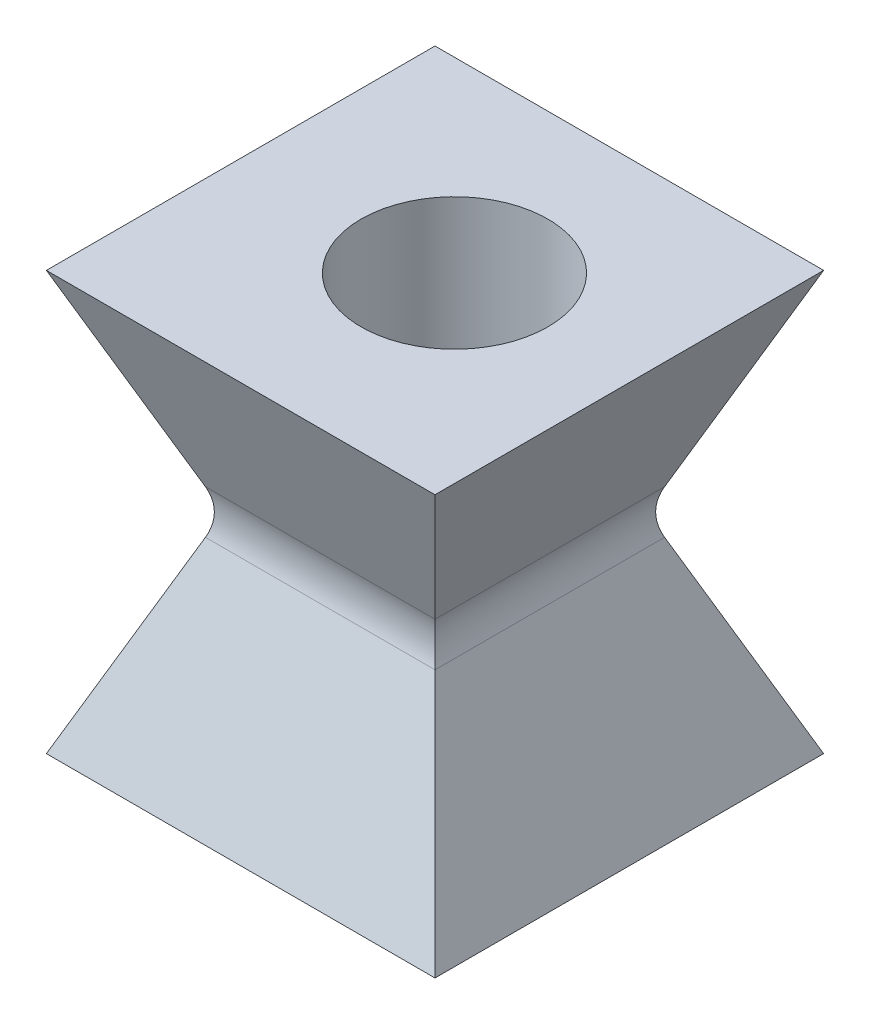
ISO-10303-21;
HEADER;
FILE_DESCRIPTION(('STEP AP214'),'2;1');
FILE_NAME('part.step','',(''),(''),'','','');
FILE_SCHEMA(('AUTOMOTIVE_DESIGN { 1 0 10303 214 1 1 1 1 }'));
ENDSEC;
DATA;
#1=APPLICATION_CONTEXT('core data for automotive mechanical design processes');
#2=APPLICATION_PROTOCOL_DEFINITION('international standard','automotive_design',2000,#1);
#3=PRODUCT_CONTEXT('',#1,'mechanical');
#4=PRODUCT('Part','Part','',(#3));
#5=PRODUCT_RELATED_PRODUCT_CATEGORY('part','',(#4));
#6=PRODUCT_DEFINITION_FORMATION('','',#4);
#7=PRODUCT_DEFINITION_CONTEXT('part definition',#1,'design');
#8=PRODUCT_DEFINITION('design','',#6,#7);
#9=PRODUCT_DEFINITION_SHAPE('','',#8);
#10=(LENGTH_UNIT() NAMED_UNIT(*) SI_UNIT(.MILLI.,.METRE.));
#11=(NAMED_UNIT(*) PLANE_ANGLE_UNIT() SI_UNIT($,.RADIAN.));
#12=(NAMED_UNIT(*) SI_UNIT($,.STERADIAN.) SOLID_ANGLE_UNIT());
#13=UNCERTAINTY_MEASURE_WITH_UNIT(LENGTH_MEASURE(1.E-05),#10,'distance_accuracy_value','');
#14=(GEOMETRIC_REPRESENTATION_CONTEXT(3) GLOBAL_UNCERTAINTY_ASSIGNED_CONTEXT((#13)) GLOBAL_UNIT_ASSIGNED_CONTEXT((#10,
#11,#12)) REPRESENTATION_CONTEXT('',''));
#15=CARTESIAN_POINT('',(0.,0.,0.));
#16=DIRECTION('',(0.,0.,1.));
#17=DIRECTION('',(1.,0.,0.));
#18=AXIS2_PLACEMENT_3D('',#15,#16,#17);
#19=CARTESIAN_POINT('',(0.,0.,104.));
#20=DIRECTION('',(0.920504853452438,0.390731128489278,0.));
#21=DIRECTION('',(-0.390731128489278,0.920504853452439,0.));
#22=AXIS2_PLACEMENT_3D('',#19,#20,#21);
#23=PLANE('',#22);
#24=DIRECTION('',(-0.363936289648106,0.857380168976599,-0.363936289648103));
#25=VECTOR('',#24,1.);
#26=CARTESIAN_POINT('',(10.6263551405311,-25.0341238979032,34.3969448482689));
#27=LINE('',#26,#25);
#28=CARTESIAN_POINT('',(-2.48783285929287,5.86096692733911,21.2827568484451));
#29=VERTEX_POINT('',#28);
#30=CARTESIAN_POINT('',(-23.7705897077382,56.,0.));
#31=VERTEX_POINT('',#30);
#32=EDGE_CURVE('E182',#29,#31,#27,.T.);
#33=ORIENTED_EDGE('',*,*,#32,.F.);
#34=DIRECTION('',(0.,0.,-1.));
#35=VECTOR('',#34,1.);
#36=CARTESIAN_POINT('',(-2.4878328592929,5.86096692733917,104.));
#37=LINE('',#36,#35);
#38=CARTESIAN_POINT('',(-2.48783285929288,5.86096692733912,82.7172431515549));
#39=VERTEX_POINT('',#38);
#40=EDGE_CURVE('E146',#29,#39,#37,.F.);
#41=ORIENTED_EDGE('',*,*,#40,.T.);
#42=DIRECTION('',(-0.363936289648106,0.857380168976599,0.363936289648103));
#43=VECTOR('',#42,1.);
#44=CARTESIAN_POINT('',(-3.14840564344317,7.41717888367835,83.3778159357052));
#45=LINE('',#44,#43);
#46=CARTESIAN_POINT('',(-23.7705897077382,56.,104.));
#47=VERTEX_POINT('',#46);
#48=EDGE_CURVE('E186',#39,#47,#45,.T.);
#49=ORIENTED_EDGE('',*,*,#48,.T.);
#50=DIRECTION('',(0.,0.,-1.));
#51=VECTOR('',#50,1.);
#52=CARTESIAN_POINT('',(-23.7705897077382,56.,104.));
#53=LINE('',#52,#51);
#54=EDGE_CURVE('E136',#47,#31,#53,.T.);
#55=ORIENTED_EDGE('',*,*,#54,.T.);
#56=EDGE_LOOP('',(#33,#41,#49,#55));
#57=FACE_BOUND('',#56,.T.);
#58=ADVANCED_FACE('F43',(#57),#23,.F.);
#59=CARTESIAN_POINT('',(0.,0.,104.));
#60=DIRECTION('',(-0.920504853452438,0.390731128489278,0.));
#61=DIRECTION('',(-0.390731128489278,-0.920504853452439,0.));
#62=AXIS2_PLACEMENT_3D('',#59,#60,#61);
#63=PLANE('',#62);
#64=DIRECTION('',(0.363936289648106,0.857380168976599,-0.363936289648103));
#65=VECTOR('',#64,1.);
#66=CARTESIAN_POINT('',(-3.14840564344317,-7.41717888367835,83.3778159357052));
#67=LINE('',#66,#65);
#68=CARTESIAN_POINT('',(-23.7705897077382,-56.,104.));
#69=VERTEX_POINT('',#68);
#70=CARTESIAN_POINT('',(-2.48783285929288,-5.86096692733912,82.7172431515549));
#71=VERTEX_POINT('',#70);
#72=EDGE_CURVE('E190',#69,#71,#67,.T.);
#73=ORIENTED_EDGE('',*,*,#72,.T.);
#74=DIRECTION('',(0.,0.,-1.));
#75=VECTOR('',#74,1.);
#76=CARTESIAN_POINT('',(-2.4878328592929,-5.86096692733917,104.));
#77=LINE('',#76,#75);
#78=CARTESIAN_POINT('',(-2.48783285929287,-5.86096692733911,21.2827568484451));
#79=VERTEX_POINT('',#78);
#80=EDGE_CURVE('E130',#71,#79,#77,.T.);
#81=ORIENTED_EDGE('',*,*,#80,.T.);
#82=DIRECTION('',(0.363936289648106,0.857380168976599,0.363936289648103));
#83=VECTOR('',#82,1.);
#84=CARTESIAN_POINT('',(10.6263551405311,25.0341238979032,34.3969448482689));
#85=LINE('',#84,#83);
#86=CARTESIAN_POINT('',(-23.7705897077382,-56.,0.));
#87=VERTEX_POINT('',#86);
#88=EDGE_CURVE('E113',#87,#79,#85,.T.);
#89=ORIENTED_EDGE('',*,*,#88,.F.);
#90=DIRECTION('',(0.,0.,-1.));
#91=VECTOR('',#90,1.);
#92=CARTESIAN_POINT('',(-23.7705897077382,-56.,104.));
#93=LINE('',#92,#91);
#94=EDGE_CURVE('E127',#69,#87,#93,.T.);
#95=ORIENTED_EDGE('',*,*,#94,.F.);
#96=EDGE_LOOP('',(#73,#81,#89,#95));
#97=FACE_BOUND('',#96,.T.);
#98=ADVANCED_FACE('F126',(#97),#63,.T.);
#99=CARTESIAN_POINT('',(47.8392064449027,20.3065383633137,104.));
#100=DIRECTION('',(0.920504853452439,0.390731128489277,0.));
#101=DIRECTION('',(-0.390731128489278,0.920504853452439,0.));
#102=AXIS2_PLACEMENT_3D('',#99,#100,#101);
#103=PLANE('',#102);
#104=DIRECTION('',(0.363936289648106,-0.857380168976599,-0.363936289648103));
#105=VECTOR('',#104,1.);
#106=CARTESIAN_POINT('',(38.3545159469048,42.651068912128,41.8748943453567));
#107=LINE('',#106,#105);
#108=CARTESIAN_POINT('',(58.9466534438166,-5.86096692733915,21.2827568484451));
#109=VERTEX_POINT('',#108);
#110=CARTESIAN_POINT('',(80.2294102922618,-56.,0.));
#111=VERTEX_POINT('',#110);
#112=EDGE_CURVE('E114',#109,#111,#107,.T.);
#113=ORIENTED_EDGE('',*,*,#112,.F.);
#114=DIRECTION('',(0.,0.,-1.));
#115=VECTOR('',#114,1.);
#116=CARTESIAN_POINT('',(58.9466534438166,-5.86096692733917,104.));
#117=LINE('',#116,#115);
#118=CARTESIAN_POINT('',(58.9466534438166,-5.86096692733912,82.7172431515549));
#119=VERTEX_POINT('',#118);
#120=EDGE_CURVE('E60',#109,#119,#117,.F.);
#121=ORIENTED_EDGE('',*,*,#120,.T.);
#122=DIRECTION('',(0.363936289648106,-0.8573801689766,0.363936289648103));
#123=VECTOR('',#122,1.);
#124=CARTESIAN_POINT('',(52.129276730879,10.1997661305465,75.8998664386174));
#125=LINE('',#124,#123);
#126=CARTESIAN_POINT('',(80.2294102922618,-56.,104.));
#127=VERTEX_POINT('',#126);
#128=EDGE_CURVE('E188',#119,#127,#125,.T.);
#129=ORIENTED_EDGE('',*,*,#128,.T.);
#130=DIRECTION('',(0.,0.,-1.));
#131=VECTOR('',#130,1.);
#132=CARTESIAN_POINT('',(80.2294102922618,-56.,104.));
#133=LINE('',#132,#131);
#134=EDGE_CURVE('E137',#127,#111,#133,.T.);
#135=ORIENTED_EDGE('',*,*,#134,.T.);
#136=EDGE_LOOP('',(#113,#121,#129,#135));
#137=FACE_BOUND('',#136,.T.);
#138=ADVANCED_FACE('F235',(#137),#103,.T.);
#139=CARTESIAN_POINT('',(47.8392064449027,-20.3065383633137,104.));
#140=DIRECTION('',(-0.920504853452439,0.390731128489277,0.));
#141=DIRECTION('',(-0.390731128489278,-0.920504853452439,0.));
#142=AXIS2_PLACEMENT_3D('',#139,#140,#141);
#143=PLANE('',#142);
#144=DIRECTION('',(-0.363936289648106,-0.8573801689766,-0.363936289648103));
#145=VECTOR('',#144,1.);
#146=CARTESIAN_POINT('',(52.129276730879,-10.1997661305465,75.8998664386174));
#147=LINE('',#146,#145);
#148=CARTESIAN_POINT('',(80.2294102922618,56.,104.));
#149=VERTEX_POINT('',#148);
#150=CARTESIAN_POINT('',(58.9466534438166,5.86096692733912,82.7172431515549));
#151=VERTEX_POINT('',#150);
#152=EDGE_CURVE('E184',#149,#151,#147,.T.);
#153=ORIENTED_EDGE('',*,*,#152,.T.);
#154=DIRECTION('',(0.,0.,-1.));
#155=VECTOR('',#154,1.);
#156=CARTESIAN_POINT('',(58.9466534438166,5.86096692733917,104.));
#157=LINE('',#156,#155);
#158=CARTESIAN_POINT('',(58.9466534438166,5.86096692733915,21.2827568484451));
#159=VERTEX_POINT('',#158);
#160=EDGE_CURVE('E153',#151,#159,#157,.T.);
#161=ORIENTED_EDGE('',*,*,#160,.T.);
#162=DIRECTION('',(-0.363936289648106,-0.857380168976599,0.363936289648103));
#163=VECTOR('',#162,1.);
#164=CARTESIAN_POINT('',(38.3545159469048,-42.651068912128,41.8748943453567));
#165=LINE('',#164,#163);
#166=CARTESIAN_POINT('',(80.2294102922618,56.,0.));
#167=VERTEX_POINT('',#166);
#168=EDGE_CURVE('E131',#167,#159,#165,.T.);
#169=ORIENTED_EDGE('',*,*,#168,.F.);
#170=DIRECTION('',(0.,0.,-1.));
#171=VECTOR('',#170,1.);
#172=CARTESIAN_POINT('',(80.2294102922618,56.,104.));
#173=LINE('',#172,#171);
#174=EDGE_CURVE('E141',#149,#167,#173,.T.);
#175=ORIENTED_EDGE('',*,*,#174,.F.);
#176=EDGE_LOOP('',(#153,#161,#169,#175));
#177=FACE_BOUND('',#176,.T.);
#178=ADVANCED_FACE('F204',(#177),#143,.F.);
#179=CARTESIAN_POINT('',(0.,56.,104.));
#180=DIRECTION('',(0.,-1.,0.));
#181=DIRECTION('',(1.,0.,0.));
#182=AXIS2_PLACEMENT_3D('',#179,#180,#181);
#183=PLANE('',#182);
#184=CARTESIAN_POINT('',(31.4375180524234,56.,50.));
#185=DIRECTION('',(0.,1.,0.));
#186=DIRECTION('',(-1.,0.,0.));
#187=AXIS2_PLACEMENT_3D('',#184,#185,#186);
#188=CIRCLE('',#187,25.);
#189=CARTESIAN_POINT('',(6.43751805242344,56.,50.));
#190=VERTEX_POINT('',#189);
#191=EDGE_CURVE('E167',#190,#190,#188,.T.);
#192=ORIENTED_EDGE('',*,*,#191,.F.);
#193=EDGE_LOOP('',(#192));
#194=FACE_BOUND('',#193,.T.);
#195=DIRECTION('',(-1.,0.,0.));
#196=VECTOR('',#195,1.);
#197=CARTESIAN_POINT('',(0.,56.,0.));
#198=LINE('',#197,#196);
#199=EDGE_CURVE('E120',#167,#31,#198,.T.);
#200=ORIENTED_EDGE('',*,*,#199,.T.);
#201=ORIENTED_EDGE('',*,*,#54,.F.);
#202=DIRECTION('',(-1.,0.,0.));
#203=VECTOR('',#202,1.);
#204=CARTESIAN_POINT('',(0.,56.,104.));
#205=LINE('',#204,#203);
#206=EDGE_CURVE('E119',#149,#47,#205,.T.);
#207=ORIENTED_EDGE('',*,*,#206,.F.);
#208=ORIENTED_EDGE('',*,*,#174,.T.);
#209=EDGE_LOOP('',(#200,#201,#207,#208));
#210=FACE_BOUND('',#209,.T.);
#211=ADVANCED_FACE('F200',(#194,#210),#183,.F.);
#212=CARTESIAN_POINT('',(0.,-56.,104.));
#213=DIRECTION('',(0.,-1.,0.));
#214=DIRECTION('',(1.,0.,0.));
#215=AXIS2_PLACEMENT_3D('',#212,#213,#214);
#216=PLANE('',#215);
#217=CARTESIAN_POINT('',(31.4375180524235,-56.,50.));
#218=DIRECTION('',(0.,1.,0.));
#219=DIRECTION('',(-1.,0.,0.));
#220=AXIS2_PLACEMENT_3D('',#217,#218,#219);
#221=CIRCLE('',#220,25.);
#222=CARTESIAN_POINT('',(6.43751805242345,-56.,50.));
#223=VERTEX_POINT('',#222);
#224=EDGE_CURVE('E172',#223,#223,#221,.T.);
#225=ORIENTED_EDGE('',*,*,#224,.T.);
#226=EDGE_LOOP('',(#225));
#227=FACE_BOUND('',#226,.T.);
#228=DIRECTION('',(-1.,0.,0.));
#229=VECTOR('',#228,1.);
#230=CARTESIAN_POINT('',(0.,-56.,0.));
#231=LINE('',#230,#229);
#232=EDGE_CURVE('E110',#111,#87,#231,.T.);
#233=ORIENTED_EDGE('',*,*,#232,.F.);
#234=ORIENTED_EDGE('',*,*,#134,.F.);
#235=DIRECTION('',(-1.,0.,0.));
#236=VECTOR('',#235,1.);
#237=CARTESIAN_POINT('',(0.,-56.,104.));
#238=LINE('',#237,#236);
#239=EDGE_CURVE('E135',#127,#69,#238,.T.);
#240=ORIENTED_EDGE('',*,*,#239,.T.);
#241=ORIENTED_EDGE('',*,*,#94,.T.);
#242=EDGE_LOOP('',(#233,#234,#240,#241));
#243=FACE_BOUND('',#242,.T.);
#244=ADVANCED_FACE('F133',(#227,#243),#216,.T.);
#245=CARTESIAN_POINT('',(80.2294102922618,8.54956562714811,20.1415144094823));
#246=DIRECTION('',(0.,-0.390731128489275,-0.92050485345244));
#247=DIRECTION('',(0.,0.92050485345244,-0.390731128489275));
#248=AXIS2_PLACEMENT_3D('',#245,#246,#247);
#249=PLANE('',#248);
#250=ORIENTED_EDGE('',*,*,#168,.T.);
#251=DIRECTION('',(-1.,0.,0.));
#252=VECTOR('',#251,1.);
#253=CARTESIAN_POINT('',(80.2294102922618,5.86096692733912,21.2827568484451));
#254=LINE('',#253,#252);
#255=EDGE_CURVE('E149',#159,#29,#254,.T.);
#256=ORIENTED_EDGE('',*,*,#255,.T.);
#257=ORIENTED_EDGE('',*,*,#32,.T.);
#258=ORIENTED_EDGE('',*,*,#199,.F.);
#259=EDGE_LOOP('',(#250,#256,#257,#258));
#260=FACE_BOUND('',#259,.T.);
#261=ADVANCED_FACE('F207',(#260),#249,.T.);
#262=CARTESIAN_POINT('',(80.2294102922618,-8.54956562714811,20.1415144094823));
#263=DIRECTION('',(0.,-0.390731128489275,0.92050485345244));
#264=DIRECTION('',(0.,-0.92050485345244,-0.390731128489275));
#265=AXIS2_PLACEMENT_3D('',#262,#263,#264);
#266=PLANE('',#265);
#267=ORIENTED_EDGE('',*,*,#88,.T.);
#268=DIRECTION('',(-1.,0.,0.));
#269=VECTOR('',#268,1.);
#270=CARTESIAN_POINT('',(80.2294102922618,-5.86096692733912,21.2827568484451));
#271=LINE('',#270,#269);
#272=EDGE_CURVE('E151',#79,#109,#271,.F.);
#273=ORIENTED_EDGE('',*,*,#272,.T.);
#274=ORIENTED_EDGE('',*,*,#112,.T.);
#275=ORIENTED_EDGE('',*,*,#232,.T.);
#276=EDGE_LOOP('',(#267,#273,#274,#275));
#277=FACE_BOUND('',#276,.T.);
#278=ADVANCED_FACE('F112',(#277),#266,.F.);
#279=CARTESIAN_POINT('',(80.2294102922618,-28.8561039904618,67.9807208543855));
#280=DIRECTION('',(0.,0.390731128489275,-0.92050485345244));
#281=DIRECTION('',(0.,0.92050485345244,0.390731128489275));
#282=AXIS2_PLACEMENT_3D('',#279,#280,#281);
#283=PLANE('',#282);
#284=ORIENTED_EDGE('',*,*,#48,.F.);
#285=DIRECTION('',(-1.,0.,0.));
#286=VECTOR('',#285,1.);
#287=CARTESIAN_POINT('',(80.2294102922618,5.86096692733912,82.7172431515549));
#288=LINE('',#287,#286);
#289=EDGE_CURVE('E11',#39,#151,#288,.F.);
#290=ORIENTED_EDGE('',*,*,#289,.T.);
#291=ORIENTED_EDGE('',*,*,#152,.F.);
#292=ORIENTED_EDGE('',*,*,#206,.T.);
#293=EDGE_LOOP('',(#284,#290,#291,#292));
#294=FACE_BOUND('',#293,.T.);
#295=ADVANCED_FACE('F217',(#294),#283,.F.);
#296=CARTESIAN_POINT('',(80.2294102922618,28.8561039904618,67.9807208543855));
#297=DIRECTION('',(0.,0.390731128489275,0.92050485345244));
#298=DIRECTION('',(0.,-0.92050485345244,0.390731128489275));
#299=AXIS2_PLACEMENT_3D('',#296,#297,#298);
#300=PLANE('',#299);
#301=ORIENTED_EDGE('',*,*,#128,.F.);
#302=DIRECTION('',(-1.,0.,0.));
#303=VECTOR('',#302,1.);
#304=CARTESIAN_POINT('',(80.2294102922618,-5.86096692733912,82.7172431515549));
#305=LINE('',#304,#303);
#306=EDGE_CURVE('E52',#119,#71,#305,.T.);
#307=ORIENTED_EDGE('',*,*,#306,.T.);
#308=ORIENTED_EDGE('',*,*,#72,.F.);
#309=ORIENTED_EDGE('',*,*,#239,.F.);
#310=EDGE_LOOP('',(#301,#307,#308,#309));
#311=FACE_BOUND('',#310,.T.);
#312=ADVANCED_FACE('F219',(#311),#300,.T.);
#313=CARTESIAN_POINT('',(31.4375180524235,-56.,50.));
#314=DIRECTION('',(0.,1.,0.));
#315=DIRECTION('',(-1.,0.,0.));
#316=AXIS2_PLACEMENT_3D('',#313,#314,#315);
#317=CYLINDRICAL_SURFACE('',#316,25.);
#318=ORIENTED_EDGE('',*,*,#224,.F.);
#319=EDGE_LOOP('',(#318));
#320=FACE_BOUND('',#319,.T.);
#321=ORIENTED_EDGE('',*,*,#191,.T.);
#322=EDGE_LOOP('',(#321));
#323=FACE_BOUND('',#322,.T.);
#324=ADVANCED_FACE('F225',(#320,#323),#317,.F.);
#325=CARTESIAN_POINT('',(72.7542262456031,0.,104.));
#326=DIRECTION('',(0.,0.,-1.));
#327=DIRECTION('',(-1.,0.,0.));
#328=AXIS2_PLACEMENT_3D('',#325,#326,#327);
#329=CYLINDRICAL_SURFACE('',#328,15.);
#330=CARTESIAN_POINT('',(72.7542262456031,0.,7.47518404665848));
#331=DIRECTION('',(-0.707106781186548,0.,-0.707106781186547));
#332=DIRECTION('',(0.707106781186548,0.,-0.707106781186547));
#333=AXIS2_PLACEMENT_3D('',#330,#331,#332);
#334=ELLIPSE('',#333,21.2132034355964,15.);
#335=EDGE_CURVE('E160',#159,#109,#334,.F.);
#336=ORIENTED_EDGE('',*,*,#335,.F.);
#337=ORIENTED_EDGE('',*,*,#160,.F.);
#338=CARTESIAN_POINT('',(72.7542262456031,0.,96.5248159533415));
#339=DIRECTION('',(-0.707106781186548,0.,0.707106781186547));
#340=DIRECTION('',(-0.707106781186548,0.,-0.707106781186547));
#341=AXIS2_PLACEMENT_3D('',#338,#339,#340);
#342=ELLIPSE('',#341,21.2132034355964,15.);
#343=EDGE_CURVE('E47',#119,#151,#342,.F.);
#344=ORIENTED_EDGE('',*,*,#343,.F.);
#345=ORIENTED_EDGE('',*,*,#120,.F.);
#346=EDGE_LOOP('',(#336,#337,#344,#345));
#347=FACE_BOUND('',#346,.T.);
#348=ADVANCED_FACE('F45',(#347),#329,.F.);
#349=CARTESIAN_POINT('',(80.2294102922618,0.,96.5248159533415));
#350=DIRECTION('',(-1.,0.,0.));
#351=DIRECTION('',(0.,0.,1.));
#352=AXIS2_PLACEMENT_3D('',#349,#350,#351);
#353=CYLINDRICAL_SURFACE('',#352,15.);
#354=ORIENTED_EDGE('',*,*,#343,.T.);
#355=ORIENTED_EDGE('',*,*,#289,.F.);
#356=CARTESIAN_POINT('',(-16.2954056610795,0.,96.5248159533415));
#357=DIRECTION('',(-0.707106781186547,0.,-0.707106781186547));
#358=DIRECTION('',(-0.707106781186547,0.,0.707106781186547));
#359=AXIS2_PLACEMENT_3D('',#356,#357,#358);
#360=ELLIPSE('',#359,21.2132034355964,15.);
#361=EDGE_CURVE('E159',#71,#39,#360,.F.);
#362=ORIENTED_EDGE('',*,*,#361,.F.);
#363=ORIENTED_EDGE('',*,*,#306,.F.);
#364=EDGE_LOOP('',(#354,#355,#362,#363));
#365=FACE_BOUND('',#364,.T.);
#366=ADVANCED_FACE('F245',(#365),#353,.F.);
#367=CARTESIAN_POINT('',(80.2294102922618,0.,7.47518404665848));
#368=DIRECTION('',(-1.,0.,0.));
#369=DIRECTION('',(0.,0.,1.));
#370=AXIS2_PLACEMENT_3D('',#367,#368,#369);
#371=CYLINDRICAL_SURFACE('',#370,15.);
#372=ORIENTED_EDGE('',*,*,#335,.T.);
#373=ORIENTED_EDGE('',*,*,#272,.F.);
#374=CARTESIAN_POINT('',(-16.2954056610795,0.,7.47518404665848));
#375=DIRECTION('',(-0.707106781186547,0.,0.707106781186547));
#376=DIRECTION('',(-0.707106781186547,0.,-0.707106781186547));
#377=AXIS2_PLACEMENT_3D('',#374,#375,#376);
#378=ELLIPSE('',#377,21.2132034355964,15.);
#379=EDGE_CURVE('E157',#29,#79,#378,.F.);
#380=ORIENTED_EDGE('',*,*,#379,.F.);
#381=ORIENTED_EDGE('',*,*,#255,.F.);
#382=EDGE_LOOP('',(#372,#373,#380,#381));
#383=FACE_BOUND('',#382,.T.);
#384=ADVANCED_FACE('F211',(#383),#371,.F.);
#385=CARTESIAN_POINT('',(-16.2954056610795,0.,104.));
#386=DIRECTION('',(0.,0.,-1.));
#387=DIRECTION('',(-1.,0.,0.));
#388=AXIS2_PLACEMENT_3D('',#385,#386,#387);
#389=CYLINDRICAL_SURFACE('',#388,15.);
#390=ORIENTED_EDGE('',*,*,#361,.T.);
#391=ORIENTED_EDGE('',*,*,#40,.F.);
#392=ORIENTED_EDGE('',*,*,#379,.T.);
#393=ORIENTED_EDGE('',*,*,#80,.F.);
#394=EDGE_LOOP('',(#390,#391,#392,#393));
#395=FACE_BOUND('',#394,.T.);
#396=ADVANCED_FACE('F214',(#395),#389,.F.);
#397=CLOSED_SHELL('',(#58,#98,#138,#178,#211,#244,#261,#278,#295,#312,#324,#348,#366,#384,#396));
#398=MANIFOLD_SOLID_BREP('B2',#397);
#399=ADVANCED_BREP_SHAPE_REPRESENTATION('',(#18,#398),#14);
#400=SHAPE_DEFINITION_REPRESENTATION(#9,#399);
ENDSEC;
END-ISO-10303-21;
